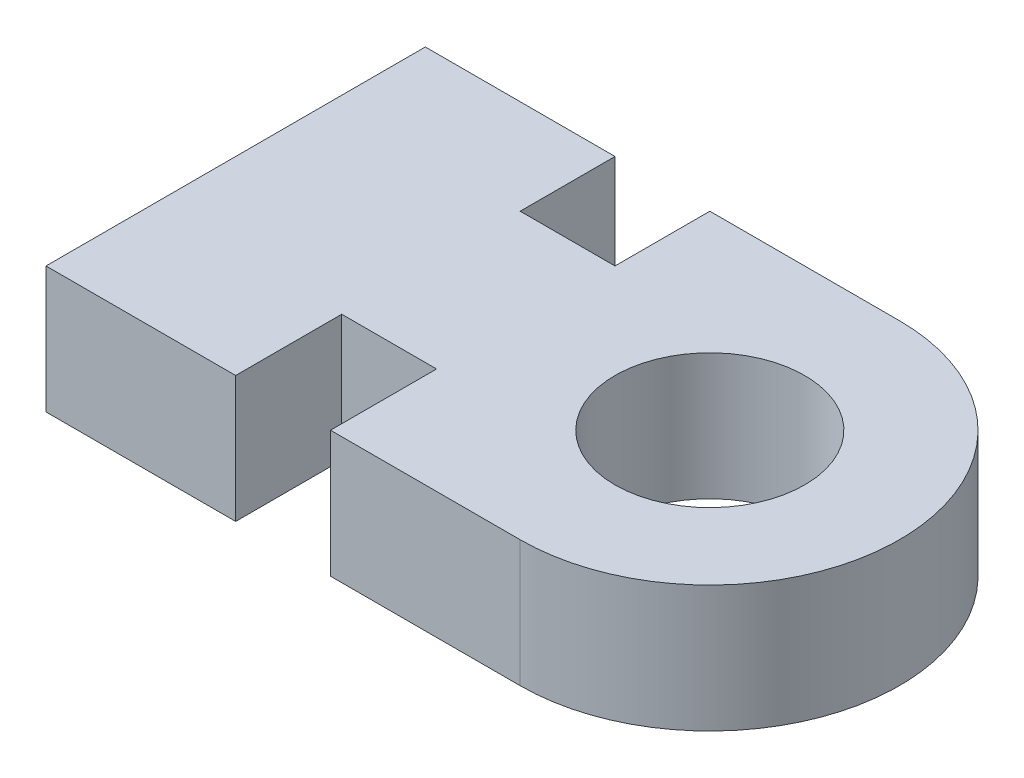
ISO-10303-21;
HEADER;
FILE_DESCRIPTION(('STEP AP214'),'2;1');
FILE_NAME('part.step','',(''),(''),'','','');
FILE_SCHEMA(('AUTOMOTIVE_DESIGN { 1 0 10303 214 1 1 1 1 }'));
ENDSEC;
DATA;
#1=APPLICATION_CONTEXT('core data for automotive mechanical design processes');
#2=APPLICATION_PROTOCOL_DEFINITION('international standard','automotive_design',2000,#1);
#3=PRODUCT_CONTEXT('',#1,'mechanical');
#4=PRODUCT('Part','Part','',(#3));
#5=PRODUCT_RELATED_PRODUCT_CATEGORY('part','',(#4));
#6=PRODUCT_DEFINITION_FORMATION('','',#4);
#7=PRODUCT_DEFINITION_CONTEXT('part definition',#1,'design');
#8=PRODUCT_DEFINITION('design','',#6,#7);
#9=PRODUCT_DEFINITION_SHAPE('','',#8);
#10=(LENGTH_UNIT() NAMED_UNIT(*) SI_UNIT(.MILLI.,.METRE.));
#11=(NAMED_UNIT(*) PLANE_ANGLE_UNIT() SI_UNIT($,.RADIAN.));
#12=(NAMED_UNIT(*) SI_UNIT($,.STERADIAN.) SOLID_ANGLE_UNIT());
#13=UNCERTAINTY_MEASURE_WITH_UNIT(LENGTH_MEASURE(1.E-05),#10,'distance_accuracy_value','');
#14=(GEOMETRIC_REPRESENTATION_CONTEXT(3) GLOBAL_UNCERTAINTY_ASSIGNED_CONTEXT((#13)) GLOBAL_UNIT_ASSIGNED_CONTEXT((#10,
#11,#12)) REPRESENTATION_CONTEXT('',''));
#15=CARTESIAN_POINT('',(0.,0.,0.));
#16=DIRECTION('',(0.,0.,1.));
#17=DIRECTION('',(1.,0.,0.));
#18=AXIS2_PLACEMENT_3D('',#15,#16,#17);
#19=CARTESIAN_POINT('',(0.,20.,0.));
#20=DIRECTION('',(0.,1.,0.));
#21=DIRECTION('',(0.,0.,1.));
#22=AXIS2_PLACEMENT_3D('',#19,#20,#21);
#23=PLANE('',#22);
#24=CARTESIAN_POINT('',(0.,20.,0.));
#25=DIRECTION('',(0.,1.,0.));
#26=DIRECTION('',(0.,0.,1.));
#27=AXIS2_PLACEMENT_3D('',#24,#25,#26);
#28=CIRCLE('',#27,30.);
#29=CARTESIAN_POINT('',(0.,20.,30.));
#30=VERTEX_POINT('',#29);
#31=CARTESIAN_POINT('',(0.,20.,-30.));
#32=VERTEX_POINT('',#31);
#33=EDGE_CURVE('E179',#30,#32,#28,.T.);
#34=ORIENTED_EDGE('',*,*,#33,.T.);
#35=DIRECTION('',(-1.,0.,0.));
#36=VECTOR('',#35,1.);
#37=CARTESIAN_POINT('',(0.,20.,-30.));
#38=LINE('',#37,#36);
#39=CARTESIAN_POINT('',(-30.,20.,-30.));
#40=VERTEX_POINT('',#39);
#41=EDGE_CURVE('E107',#32,#40,#38,.T.);
#42=ORIENTED_EDGE('',*,*,#41,.T.);
#43=DIRECTION('',(0.,0.,1.));
#44=VECTOR('',#43,1.);
#45=CARTESIAN_POINT('',(-30.,20.,-30.));
#46=LINE('',#45,#44);
#47=CARTESIAN_POINT('',(-30.,20.,-15.));
#48=VERTEX_POINT('',#47);
#49=EDGE_CURVE('E206',#40,#48,#46,.T.);
#50=ORIENTED_EDGE('',*,*,#49,.T.);
#51=DIRECTION('',(-1.,0.,0.));
#52=VECTOR('',#51,1.);
#53=CARTESIAN_POINT('',(-30.,20.,-15.));
#54=LINE('',#53,#52);
#55=CARTESIAN_POINT('',(-45.,20.,-15.));
#56=VERTEX_POINT('',#55);
#57=EDGE_CURVE('E225',#48,#56,#54,.T.);
#58=ORIENTED_EDGE('',*,*,#57,.T.);
#59=DIRECTION('',(0.,0.,-1.));
#60=VECTOR('',#59,1.);
#61=CARTESIAN_POINT('',(-45.,20.,-15.));
#62=LINE('',#61,#60);
#63=CARTESIAN_POINT('',(-45.,20.,-30.));
#64=VERTEX_POINT('',#63);
#65=EDGE_CURVE('E222',#56,#64,#62,.T.);
#66=ORIENTED_EDGE('',*,*,#65,.T.);
#67=DIRECTION('',(-1.,0.,0.));
#68=VECTOR('',#67,1.);
#69=CARTESIAN_POINT('',(-45.,20.,-30.));
#70=LINE('',#69,#68);
#71=CARTESIAN_POINT('',(-75.,20.,-30.));
#72=VERTEX_POINT('',#71);
#73=EDGE_CURVE('E224',#64,#72,#70,.T.);
#74=ORIENTED_EDGE('',*,*,#73,.T.);
#75=DIRECTION('',(0.,0.,1.));
#76=VECTOR('',#75,1.);
#77=CARTESIAN_POINT('',(-75.,20.,-30.));
#78=LINE('',#77,#76);
#79=CARTESIAN_POINT('',(-75.,20.,30.));
#80=VERTEX_POINT('',#79);
#81=EDGE_CURVE('E227',#72,#80,#78,.T.);
#82=ORIENTED_EDGE('',*,*,#81,.T.);
#83=DIRECTION('',(1.,0.,0.));
#84=VECTOR('',#83,1.);
#85=CARTESIAN_POINT('',(-75.,20.,30.));
#86=LINE('',#85,#84);
#87=CARTESIAN_POINT('',(-45.,20.,30.));
#88=VERTEX_POINT('',#87);
#89=EDGE_CURVE('E233',#80,#88,#86,.T.);
#90=ORIENTED_EDGE('',*,*,#89,.T.);
#91=DIRECTION('',(0.,0.,-1.));
#92=VECTOR('',#91,1.);
#93=CARTESIAN_POINT('',(-45.,20.,30.));
#94=LINE('',#93,#92);
#95=CARTESIAN_POINT('',(-45.,20.,13.2228787257919));
#96=VERTEX_POINT('',#95);
#97=EDGE_CURVE('E138',#88,#96,#94,.T.);
#98=ORIENTED_EDGE('',*,*,#97,.T.);
#99=DIRECTION('',(1.,0.,0.));
#100=VECTOR('',#99,1.);
#101=CARTESIAN_POINT('',(-45.,20.,13.2228787257919));
#102=LINE('',#101,#100);
#103=CARTESIAN_POINT('',(-30.,20.,13.2228787257919));
#104=VERTEX_POINT('',#103);
#105=EDGE_CURVE('E132',#96,#104,#102,.T.);
#106=ORIENTED_EDGE('',*,*,#105,.T.);
#107=DIRECTION('',(0.,0.,1.));
#108=VECTOR('',#107,1.);
#109=CARTESIAN_POINT('',(-30.,20.,13.2228787257919));
#110=LINE('',#109,#108);
#111=CARTESIAN_POINT('',(-30.,20.,30.));
#112=VERTEX_POINT('',#111);
#113=EDGE_CURVE('E136',#104,#112,#110,.T.);
#114=ORIENTED_EDGE('',*,*,#113,.T.);
#115=DIRECTION('',(1.,0.,0.));
#116=VECTOR('',#115,1.);
#117=CARTESIAN_POINT('',(-30.,20.,30.));
#118=LINE('',#117,#116);
#119=EDGE_CURVE('E52',#112,#30,#118,.T.);
#120=ORIENTED_EDGE('',*,*,#119,.T.);
#121=EDGE_LOOP('',(#34,#42,#50,#58,#66,#74,#82,#90,#98,#106,#114,#120));
#122=FACE_BOUND('',#121,.T.);
#123=CARTESIAN_POINT('',(0.,20.,0.));
#124=DIRECTION('',(0.,1.,0.));
#125=DIRECTION('',(0.,0.,1.));
#126=AXIS2_PLACEMENT_3D('',#123,#124,#125);
#127=CIRCLE('',#126,15.);
#128=CARTESIAN_POINT('',(0.,20.,15.));
#129=VERTEX_POINT('',#128);
#130=EDGE_CURVE('E160',#129,#129,#127,.T.);
#131=ORIENTED_EDGE('',*,*,#130,.F.);
#132=EDGE_LOOP('',(#131));
#133=FACE_BOUND('',#132,.T.);
#134=ADVANCED_FACE('F35',(#122,#133),#23,.T.);
#135=CARTESIAN_POINT('',(0.,0.,0.));
#136=DIRECTION('',(0.,1.,0.));
#137=DIRECTION('',(0.,0.,1.));
#138=AXIS2_PLACEMENT_3D('',#135,#136,#137);
#139=PLANE('',#138);
#140=CARTESIAN_POINT('',(0.,0.,0.));
#141=DIRECTION('',(0.,1.,0.));
#142=DIRECTION('',(0.,0.,1.));
#143=AXIS2_PLACEMENT_3D('',#140,#141,#142);
#144=CIRCLE('',#143,30.);
#145=CARTESIAN_POINT('',(0.,0.,30.));
#146=VERTEX_POINT('',#145);
#147=CARTESIAN_POINT('',(0.,0.,-30.));
#148=VERTEX_POINT('',#147);
#149=EDGE_CURVE('E156',#146,#148,#144,.T.);
#150=ORIENTED_EDGE('',*,*,#149,.F.);
#151=DIRECTION('',(1.,0.,0.));
#152=VECTOR('',#151,1.);
#153=CARTESIAN_POINT('',(-30.,0.,30.));
#154=LINE('',#153,#152);
#155=CARTESIAN_POINT('',(-30.,0.,30.));
#156=VERTEX_POINT('',#155);
#157=EDGE_CURVE('E99',#156,#146,#154,.T.);
#158=ORIENTED_EDGE('',*,*,#157,.F.);
#159=DIRECTION('',(0.,0.,1.));
#160=VECTOR('',#159,1.);
#161=CARTESIAN_POINT('',(-30.,0.,13.2228787257919));
#162=LINE('',#161,#160);
#163=CARTESIAN_POINT('',(-30.,0.,13.2228787257919));
#164=VERTEX_POINT('',#163);
#165=EDGE_CURVE('E93',#164,#156,#162,.T.);
#166=ORIENTED_EDGE('',*,*,#165,.F.);
#167=DIRECTION('',(1.,0.,0.));
#168=VECTOR('',#167,1.);
#169=CARTESIAN_POINT('',(-45.,0.,13.2228787257919));
#170=LINE('',#169,#168);
#171=CARTESIAN_POINT('',(-45.,0.,13.2228787257919));
#172=VERTEX_POINT('',#171);
#173=EDGE_CURVE('E146',#172,#164,#170,.T.);
#174=ORIENTED_EDGE('',*,*,#173,.F.);
#175=DIRECTION('',(0.,0.,-1.));
#176=VECTOR('',#175,1.);
#177=CARTESIAN_POINT('',(-45.,0.,30.));
#178=LINE('',#177,#176);
#179=CARTESIAN_POINT('',(-45.,0.,30.));
#180=VERTEX_POINT('',#179);
#181=EDGE_CURVE('E174',#180,#172,#178,.T.);
#182=ORIENTED_EDGE('',*,*,#181,.F.);
#183=DIRECTION('',(1.,0.,0.));
#184=VECTOR('',#183,1.);
#185=CARTESIAN_POINT('',(-75.,0.,30.));
#186=LINE('',#185,#184);
#187=CARTESIAN_POINT('',(-75.,0.,30.));
#188=VERTEX_POINT('',#187);
#189=EDGE_CURVE('E172',#188,#180,#186,.T.);
#190=ORIENTED_EDGE('',*,*,#189,.F.);
#191=DIRECTION('',(0.,0.,1.));
#192=VECTOR('',#191,1.);
#193=CARTESIAN_POINT('',(-75.,0.,-30.));
#194=LINE('',#193,#192);
#195=CARTESIAN_POINT('',(-75.,0.,-30.));
#196=VERTEX_POINT('',#195);
#197=EDGE_CURVE('E170',#196,#188,#194,.T.);
#198=ORIENTED_EDGE('',*,*,#197,.F.);
#199=DIRECTION('',(-1.,0.,0.));
#200=VECTOR('',#199,1.);
#201=CARTESIAN_POINT('',(-45.,0.,-30.));
#202=LINE('',#201,#200);
#203=CARTESIAN_POINT('',(-45.,0.,-30.));
#204=VERTEX_POINT('',#203);
#205=EDGE_CURVE('E168',#204,#196,#202,.T.);
#206=ORIENTED_EDGE('',*,*,#205,.F.);
#207=DIRECTION('',(0.,0.,-1.));
#208=VECTOR('',#207,1.);
#209=CARTESIAN_POINT('',(-45.,0.,-15.));
#210=LINE('',#209,#208);
#211=CARTESIAN_POINT('',(-45.,0.,-15.));
#212=VERTEX_POINT('',#211);
#213=EDGE_CURVE('E166',#212,#204,#210,.T.);
#214=ORIENTED_EDGE('',*,*,#213,.F.);
#215=DIRECTION('',(-1.,0.,0.));
#216=VECTOR('',#215,1.);
#217=CARTESIAN_POINT('',(-30.,0.,-15.));
#218=LINE('',#217,#216);
#219=CARTESIAN_POINT('',(-30.,0.,-15.));
#220=VERTEX_POINT('',#219);
#221=EDGE_CURVE('E164',#220,#212,#218,.T.);
#222=ORIENTED_EDGE('',*,*,#221,.F.);
#223=DIRECTION('',(0.,0.,1.));
#224=VECTOR('',#223,1.);
#225=CARTESIAN_POINT('',(-30.,0.,-30.));
#226=LINE('',#225,#224);
#227=CARTESIAN_POINT('',(-30.,0.,-30.));
#228=VERTEX_POINT('',#227);
#229=EDGE_CURVE('E162',#228,#220,#226,.T.);
#230=ORIENTED_EDGE('',*,*,#229,.F.);
#231=DIRECTION('',(-1.,0.,0.));
#232=VECTOR('',#231,1.);
#233=CARTESIAN_POINT('',(0.,0.,-30.));
#234=LINE('',#233,#232);
#235=EDGE_CURVE('E159',#148,#228,#234,.T.);
#236=ORIENTED_EDGE('',*,*,#235,.F.);
#237=EDGE_LOOP('',(#150,#158,#166,#174,#182,#190,#198,#206,#214,#222,#230,#236));
#238=FACE_BOUND('',#237,.T.);
#239=CARTESIAN_POINT('',(0.,0.,0.));
#240=DIRECTION('',(0.,1.,0.));
#241=DIRECTION('',(0.,0.,1.));
#242=AXIS2_PLACEMENT_3D('',#239,#240,#241);
#243=CIRCLE('',#242,15.);
#244=CARTESIAN_POINT('',(0.,0.,15.));
#245=VERTEX_POINT('',#244);
#246=EDGE_CURVE('E380',#245,#245,#243,.T.);
#247=ORIENTED_EDGE('',*,*,#246,.T.);
#248=EDGE_LOOP('',(#247));
#249=FACE_BOUND('',#248,.T.);
#250=ADVANCED_FACE('F210',(#238,#249),#139,.F.);
#251=CARTESIAN_POINT('',(0.,20.,0.));
#252=DIRECTION('',(0.,-1.,0.));
#253=DIRECTION('',(0.,0.,-1.));
#254=AXIS2_PLACEMENT_3D('',#251,#252,#253);
#255=CYLINDRICAL_SURFACE('',#254,30.);
#256=ORIENTED_EDGE('',*,*,#149,.T.);
#257=DIRECTION('',(0.,-1.,0.));
#258=VECTOR('',#257,1.);
#259=CARTESIAN_POINT('',(0.,20.,-30.));
#260=LINE('',#259,#258);
#261=EDGE_CURVE('E11',#32,#148,#260,.T.);
#262=ORIENTED_EDGE('',*,*,#261,.F.);
#263=ORIENTED_EDGE('',*,*,#33,.F.);
#264=DIRECTION('',(0.,-1.,0.));
#265=VECTOR('',#264,1.);
#266=CARTESIAN_POINT('',(0.,20.,30.));
#267=LINE('',#266,#265);
#268=EDGE_CURVE('E152',#30,#146,#267,.T.);
#269=ORIENTED_EDGE('',*,*,#268,.T.);
#270=EDGE_LOOP('',(#256,#262,#263,#269));
#271=FACE_BOUND('',#270,.T.);
#272=ADVANCED_FACE('F37',(#271),#255,.T.);
#273=CARTESIAN_POINT('',(0.,20.,-30.));
#274=DIRECTION('',(0.,0.,1.));
#275=DIRECTION('',(1.,0.,0.));
#276=AXIS2_PLACEMENT_3D('',#273,#274,#275);
#277=PLANE('',#276);
#278=ORIENTED_EDGE('',*,*,#235,.T.);
#279=DIRECTION('',(0.,-1.,0.));
#280=VECTOR('',#279,1.);
#281=CARTESIAN_POINT('',(-30.,20.,-30.));
#282=LINE('',#281,#280);
#283=EDGE_CURVE('E44',#40,#228,#282,.T.);
#284=ORIENTED_EDGE('',*,*,#283,.F.);
#285=ORIENTED_EDGE('',*,*,#41,.F.);
#286=ORIENTED_EDGE('',*,*,#261,.T.);
#287=EDGE_LOOP('',(#278,#284,#285,#286));
#288=FACE_BOUND('',#287,.T.);
#289=ADVANCED_FACE('F267',(#288),#277,.F.);
#290=CARTESIAN_POINT('',(-30.,20.,-30.));
#291=DIRECTION('',(1.,0.,0.));
#292=DIRECTION('',(0.,0.,-1.));
#293=AXIS2_PLACEMENT_3D('',#290,#291,#292);
#294=PLANE('',#293);
#295=ORIENTED_EDGE('',*,*,#229,.T.);
#296=DIRECTION('',(0.,-1.,0.));
#297=VECTOR('',#296,1.);
#298=CARTESIAN_POINT('',(-30.,20.,-15.));
#299=LINE('',#298,#297);
#300=EDGE_CURVE('E198',#48,#220,#299,.T.);
#301=ORIENTED_EDGE('',*,*,#300,.F.);
#302=ORIENTED_EDGE('',*,*,#49,.F.);
#303=ORIENTED_EDGE('',*,*,#283,.T.);
#304=EDGE_LOOP('',(#295,#301,#302,#303));
#305=FACE_BOUND('',#304,.T.);
#306=ADVANCED_FACE('F204',(#305),#294,.F.);
#307=CARTESIAN_POINT('',(-30.,20.,-15.));
#308=DIRECTION('',(0.,0.,1.));
#309=DIRECTION('',(1.,0.,0.));
#310=AXIS2_PLACEMENT_3D('',#307,#308,#309);
#311=PLANE('',#310);
#312=ORIENTED_EDGE('',*,*,#221,.T.);
#313=DIRECTION('',(0.,-1.,0.));
#314=VECTOR('',#313,1.);
#315=CARTESIAN_POINT('',(-45.,20.,-15.));
#316=LINE('',#315,#314);
#317=EDGE_CURVE('E195',#56,#212,#316,.T.);
#318=ORIENTED_EDGE('',*,*,#317,.F.);
#319=ORIENTED_EDGE('',*,*,#57,.F.);
#320=ORIENTED_EDGE('',*,*,#300,.T.);
#321=EDGE_LOOP('',(#312,#318,#319,#320));
#322=FACE_BOUND('',#321,.T.);
#323=ADVANCED_FACE('F216',(#322),#311,.F.);
#324=CARTESIAN_POINT('',(-45.,20.,-15.));
#325=DIRECTION('',(-1.,0.,0.));
#326=DIRECTION('',(0.,0.,1.));
#327=AXIS2_PLACEMENT_3D('',#324,#325,#326);
#328=PLANE('',#327);
#329=ORIENTED_EDGE('',*,*,#213,.T.);
#330=DIRECTION('',(0.,-1.,0.));
#331=VECTOR('',#330,1.);
#332=CARTESIAN_POINT('',(-45.,20.,-30.));
#333=LINE('',#332,#331);
#334=EDGE_CURVE('E192',#64,#204,#333,.T.);
#335=ORIENTED_EDGE('',*,*,#334,.F.);
#336=ORIENTED_EDGE('',*,*,#65,.F.);
#337=ORIENTED_EDGE('',*,*,#317,.T.);
#338=EDGE_LOOP('',(#329,#335,#336,#337));
#339=FACE_BOUND('',#338,.T.);
#340=ADVANCED_FACE('F220',(#339),#328,.F.);
#341=CARTESIAN_POINT('',(-45.,20.,-30.));
#342=DIRECTION('',(0.,0.,1.));
#343=DIRECTION('',(1.,0.,0.));
#344=AXIS2_PLACEMENT_3D('',#341,#342,#343);
#345=PLANE('',#344);
#346=ORIENTED_EDGE('',*,*,#205,.T.);
#347=DIRECTION('',(0.,-1.,0.));
#348=VECTOR('',#347,1.);
#349=CARTESIAN_POINT('',(-75.,20.,-30.));
#350=LINE('',#349,#348);
#351=EDGE_CURVE('E189',#72,#196,#350,.T.);
#352=ORIENTED_EDGE('',*,*,#351,.F.);
#353=ORIENTED_EDGE('',*,*,#73,.F.);
#354=ORIENTED_EDGE('',*,*,#334,.T.);
#355=EDGE_LOOP('',(#346,#352,#353,#354));
#356=FACE_BOUND('',#355,.T.);
#357=ADVANCED_FACE('F280',(#356),#345,.F.);
#358=CARTESIAN_POINT('',(-75.,20.,-30.));
#359=DIRECTION('',(1.,0.,0.));
#360=DIRECTION('',(0.,0.,-1.));
#361=AXIS2_PLACEMENT_3D('',#358,#359,#360);
#362=PLANE('',#361);
#363=ORIENTED_EDGE('',*,*,#197,.T.);
#364=DIRECTION('',(0.,-1.,0.));
#365=VECTOR('',#364,1.);
#366=CARTESIAN_POINT('',(-75.,20.,30.));
#367=LINE('',#366,#365);
#368=EDGE_CURVE('E186',#80,#188,#367,.T.);
#369=ORIENTED_EDGE('',*,*,#368,.F.);
#370=ORIENTED_EDGE('',*,*,#81,.F.);
#371=ORIENTED_EDGE('',*,*,#351,.T.);
#372=EDGE_LOOP('',(#363,#369,#370,#371));
#373=FACE_BOUND('',#372,.T.);
#374=ADVANCED_FACE('F283',(#373),#362,.F.);
#375=CARTESIAN_POINT('',(-75.,20.,30.));
#376=DIRECTION('',(0.,0.,-1.));
#377=DIRECTION('',(-1.,0.,0.));
#378=AXIS2_PLACEMENT_3D('',#375,#376,#377);
#379=PLANE('',#378);
#380=ORIENTED_EDGE('',*,*,#189,.T.);
#381=DIRECTION('',(0.,-1.,0.));
#382=VECTOR('',#381,1.);
#383=CARTESIAN_POINT('',(-45.,20.,30.));
#384=LINE('',#383,#382);
#385=EDGE_CURVE('E183',#88,#180,#384,.T.);
#386=ORIENTED_EDGE('',*,*,#385,.F.);
#387=ORIENTED_EDGE('',*,*,#89,.F.);
#388=ORIENTED_EDGE('',*,*,#368,.T.);
#389=EDGE_LOOP('',(#380,#386,#387,#388));
#390=FACE_BOUND('',#389,.T.);
#391=ADVANCED_FACE('F239',(#390),#379,.F.);
#392=CARTESIAN_POINT('',(-45.,20.,30.));
#393=DIRECTION('',(-1.,0.,0.));
#394=DIRECTION('',(0.,0.,1.));
#395=AXIS2_PLACEMENT_3D('',#392,#393,#394);
#396=PLANE('',#395);
#397=ORIENTED_EDGE('',*,*,#181,.T.);
#398=DIRECTION('',(0.,-1.,0.));
#399=VECTOR('',#398,1.);
#400=CARTESIAN_POINT('',(-45.,20.,13.2228787257919));
#401=LINE('',#400,#399);
#402=EDGE_CURVE('E147',#96,#172,#401,.T.);
#403=ORIENTED_EDGE('',*,*,#402,.F.);
#404=ORIENTED_EDGE('',*,*,#97,.F.);
#405=ORIENTED_EDGE('',*,*,#385,.T.);
#406=EDGE_LOOP('',(#397,#403,#404,#405));
#407=FACE_BOUND('',#406,.T.);
#408=ADVANCED_FACE('F243',(#407),#396,.F.);
#409=CARTESIAN_POINT('',(-45.,20.,13.2228787257919));
#410=DIRECTION('',(0.,0.,-1.));
#411=DIRECTION('',(-1.,0.,0.));
#412=AXIS2_PLACEMENT_3D('',#409,#410,#411);
#413=PLANE('',#412);
#414=ORIENTED_EDGE('',*,*,#173,.T.);
#415=DIRECTION('',(0.,-1.,0.));
#416=VECTOR('',#415,1.);
#417=CARTESIAN_POINT('',(-30.,20.,13.2228787257919));
#418=LINE('',#417,#416);
#419=EDGE_CURVE('E143',#104,#164,#418,.T.);
#420=ORIENTED_EDGE('',*,*,#419,.F.);
#421=ORIENTED_EDGE('',*,*,#105,.F.);
#422=ORIENTED_EDGE('',*,*,#402,.T.);
#423=EDGE_LOOP('',(#414,#420,#421,#422));
#424=FACE_BOUND('',#423,.T.);
#425=ADVANCED_FACE('F144',(#424),#413,.F.);
#426=CARTESIAN_POINT('',(-30.,20.,13.2228787257919));
#427=DIRECTION('',(1.,0.,0.));
#428=DIRECTION('',(0.,0.,-1.));
#429=AXIS2_PLACEMENT_3D('',#426,#427,#428);
#430=PLANE('',#429);
#431=ORIENTED_EDGE('',*,*,#165,.T.);
#432=DIRECTION('',(0.,-1.,0.));
#433=VECTOR('',#432,1.);
#434=CARTESIAN_POINT('',(-30.,20.,30.));
#435=LINE('',#434,#433);
#436=EDGE_CURVE('E148',#112,#156,#435,.T.);
#437=ORIENTED_EDGE('',*,*,#436,.F.);
#438=ORIENTED_EDGE('',*,*,#113,.F.);
#439=ORIENTED_EDGE('',*,*,#419,.T.);
#440=EDGE_LOOP('',(#431,#437,#438,#439));
#441=FACE_BOUND('',#440,.T.);
#442=ADVANCED_FACE('F150',(#441),#430,.F.);
#443=CARTESIAN_POINT('',(-30.,20.,30.));
#444=DIRECTION('',(0.,0.,-1.));
#445=DIRECTION('',(-1.,0.,0.));
#446=AXIS2_PLACEMENT_3D('',#443,#444,#445);
#447=PLANE('',#446);
#448=ORIENTED_EDGE('',*,*,#157,.T.);
#449=ORIENTED_EDGE('',*,*,#268,.F.);
#450=ORIENTED_EDGE('',*,*,#119,.F.);
#451=ORIENTED_EDGE('',*,*,#436,.T.);
#452=EDGE_LOOP('',(#448,#449,#450,#451));
#453=FACE_BOUND('',#452,.T.);
#454=ADVANCED_FACE('F247',(#453),#447,.F.);
#455=CARTESIAN_POINT('',(0.,20.,0.));
#456=DIRECTION('',(0.,-1.,0.));
#457=DIRECTION('',(0.,0.,-1.));
#458=AXIS2_PLACEMENT_3D('',#455,#456,#457);
#459=CYLINDRICAL_SURFACE('',#458,15.);
#460=ORIENTED_EDGE('',*,*,#130,.T.);
#461=EDGE_LOOP('',(#460));
#462=FACE_BOUND('',#461,.T.);
#463=ORIENTED_EDGE('',*,*,#246,.F.);
#464=EDGE_LOOP('',(#463));
#465=FACE_BOUND('',#464,.T.);
#466=ADVANCED_FACE('F249',(#462,#465),#459,.F.);
#467=CLOSED_SHELL('',(#134,#250,#272,#289,#306,#323,#340,#357,#374,#391,#408,#425,#442,#454,#466));
#468=MANIFOLD_SOLID_BREP('B2',#467);
#469=ADVANCED_BREP_SHAPE_REPRESENTATION('',(#18,#468),#14);
#470=SHAPE_DEFINITION_REPRESENTATION(#9,#469);
ENDSEC;
END-ISO-10303-21;
